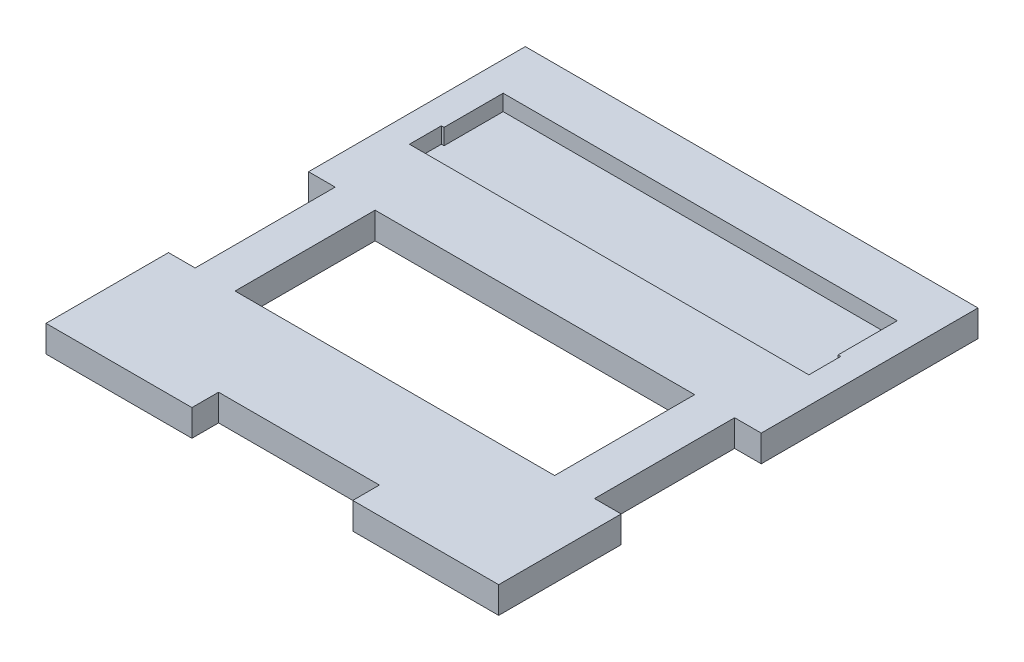
ISO-10303-21;
HEADER;
FILE_DESCRIPTION(('STEP AP214'),'2;1');
FILE_NAME('part.step','',(''),(''),'','','');
FILE_SCHEMA(('AUTOMOTIVE_DESIGN { 1 0 10303 214 1 1 1 1 }'));
ENDSEC;
DATA;
#1=APPLICATION_CONTEXT('core data for automotive mechanical design processes');
#2=APPLICATION_PROTOCOL_DEFINITION('international standard','automotive_design',2000,#1);
#3=PRODUCT_CONTEXT('',#1,'mechanical');
#4=PRODUCT('Part','Part','',(#3));
#5=PRODUCT_RELATED_PRODUCT_CATEGORY('part','',(#4));
#6=PRODUCT_DEFINITION_FORMATION('','',#4);
#7=PRODUCT_DEFINITION_CONTEXT('part definition',#1,'design');
#8=PRODUCT_DEFINITION('design','',#6,#7);
#9=PRODUCT_DEFINITION_SHAPE('','',#8);
#10=(LENGTH_UNIT() NAMED_UNIT(*) SI_UNIT(.MILLI.,.METRE.));
#11=(NAMED_UNIT(*) PLANE_ANGLE_UNIT() SI_UNIT($,.RADIAN.));
#12=(NAMED_UNIT(*) SI_UNIT($,.STERADIAN.) SOLID_ANGLE_UNIT());
#13=UNCERTAINTY_MEASURE_WITH_UNIT(LENGTH_MEASURE(1.E-05),#10,'distance_accuracy_value','');
#14=(GEOMETRIC_REPRESENTATION_CONTEXT(3) GLOBAL_UNCERTAINTY_ASSIGNED_CONTEXT((#13)) GLOBAL_UNIT_ASSIGNED_CONTEXT((#10,
#11,#12)) REPRESENTATION_CONTEXT('',''));
#15=CARTESIAN_POINT('',(0.,0.,0.));
#16=DIRECTION('',(0.,0.,1.));
#17=DIRECTION('',(1.,0.,0.));
#18=AXIS2_PLACEMENT_3D('',#15,#16,#17);
#19=CARTESIAN_POINT('',(-42.5,5.,45.));
#20=DIRECTION('',(0.,0.,-1.));
#21=DIRECTION('',(-1.,0.,0.));
#22=AXIS2_PLACEMENT_3D('',#19,#20,#21);
#23=PLANE('',#22);
#24=DIRECTION('',(0.,1.,0.));
#25=VECTOR('',#24,1.);
#26=CARTESIAN_POINT('',(15.1,0.,45.));
#27=LINE('',#26,#25);
#28=CARTESIAN_POINT('',(15.1,0.,45.));
#29=VERTEX_POINT('',#28);
#30=CARTESIAN_POINT('',(15.1,5.,45.));
#31=VERTEX_POINT('',#30);
#32=EDGE_CURVE('E307',#29,#31,#27,.T.);
#33=ORIENTED_EDGE('',*,*,#32,.F.);
#34=DIRECTION('',(1.,0.,0.));
#35=VECTOR('',#34,1.);
#36=CARTESIAN_POINT('',(-42.5,0.,45.));
#37=LINE('',#36,#35);
#38=CARTESIAN_POINT('',(42.5,0.,45.));
#39=VERTEX_POINT('',#38);
#40=EDGE_CURVE('E399',#29,#39,#37,.T.);
#41=ORIENTED_EDGE('',*,*,#40,.T.);
#42=DIRECTION('',(0.,-1.,0.));
#43=VECTOR('',#42,1.);
#44=CARTESIAN_POINT('',(42.5,5.,45.));
#45=LINE('',#44,#43);
#46=CARTESIAN_POINT('',(42.5,5.,45.));
#47=VERTEX_POINT('',#46);
#48=EDGE_CURVE('E387',#47,#39,#45,.T.);
#49=ORIENTED_EDGE('',*,*,#48,.F.);
#50=DIRECTION('',(1.,0.,0.));
#51=VECTOR('',#50,1.);
#52=CARTESIAN_POINT('',(-42.5,5.,45.));
#53=LINE('',#52,#51);
#54=EDGE_CURVE('E385',#31,#47,#53,.T.);
#55=ORIENTED_EDGE('',*,*,#54,.F.);
#56=EDGE_LOOP('',(#33,#41,#49,#55));
#57=FACE_BOUND('',#56,.T.);
#58=ADVANCED_FACE('F39',(#57),#23,.F.);
#59=CARTESIAN_POINT('',(0.,5.,0.));
#60=DIRECTION('',(0.,-1.,0.));
#61=DIRECTION('',(0.,0.,-1.));
#62=AXIS2_PLACEMENT_3D('',#59,#60,#61);
#63=PLANE('',#62);
#64=DIRECTION('',(-1.,0.,0.));
#65=VECTOR('',#64,1.);
#66=CARTESIAN_POINT('',(37.5,5.,-24.24));
#67=LINE('',#66,#65);
#68=CARTESIAN_POINT('',(37.5,5.,-24.24));
#69=VERTEX_POINT('',#68);
#70=CARTESIAN_POINT('',(37.,5.,-24.24));
#71=VERTEX_POINT('',#70);
#72=EDGE_CURVE('E265',#69,#71,#67,.T.);
#73=ORIENTED_EDGE('',*,*,#72,.F.);
#74=DIRECTION('',(0.,0.,-1.));
#75=VECTOR('',#74,1.);
#76=CARTESIAN_POINT('',(37.5,5.,-24.24));
#77=LINE('',#76,#75);
#78=CARTESIAN_POINT('',(37.5,5.,-18.24));
#79=VERTEX_POINT('',#78);
#80=EDGE_CURVE('E53',#79,#69,#77,.T.);
#81=ORIENTED_EDGE('',*,*,#80,.F.);
#82=DIRECTION('',(1.,0.,0.));
#83=VECTOR('',#82,1.);
#84=CARTESIAN_POINT('',(-37.5,5.,-18.24));
#85=LINE('',#84,#83);
#86=CARTESIAN_POINT('',(-37.5,5.,-18.24));
#87=VERTEX_POINT('',#86);
#88=EDGE_CURVE('E242',#87,#79,#85,.T.);
#89=ORIENTED_EDGE('',*,*,#88,.F.);
#90=DIRECTION('',(0.,0.,1.));
#91=VECTOR('',#90,1.);
#92=CARTESIAN_POINT('',(-37.5,5.,-24.24));
#93=LINE('',#92,#91);
#94=CARTESIAN_POINT('',(-37.5,5.,-24.24));
#95=VERTEX_POINT('',#94);
#96=EDGE_CURVE('E250',#95,#87,#93,.T.);
#97=ORIENTED_EDGE('',*,*,#96,.F.);
#98=DIRECTION('',(-1.,0.,0.));
#99=VECTOR('',#98,1.);
#100=CARTESIAN_POINT('',(-37.5,5.,-24.24));
#101=LINE('',#100,#99);
#102=CARTESIAN_POINT('',(-37.,5.,-24.24));
#103=VERTEX_POINT('',#102);
#104=EDGE_CURVE('E273',#103,#95,#101,.T.);
#105=ORIENTED_EDGE('',*,*,#104,.F.);
#106=DIRECTION('',(0.,0.,1.));
#107=VECTOR('',#106,1.);
#108=CARTESIAN_POINT('',(-37.,5.,-35.34));
#109=LINE('',#108,#107);
#110=CARTESIAN_POINT('',(-37.,5.,-35.34));
#111=VERTEX_POINT('',#110);
#112=EDGE_CURVE('E275',#111,#103,#109,.T.);
#113=ORIENTED_EDGE('',*,*,#112,.F.);
#114=DIRECTION('',(-1.,0.,0.));
#115=VECTOR('',#114,1.);
#116=CARTESIAN_POINT('',(-37.,5.,-35.34));
#117=LINE('',#116,#115);
#118=CARTESIAN_POINT('',(37.,5.,-35.34));
#119=VERTEX_POINT('',#118);
#120=EDGE_CURVE('E268',#119,#111,#117,.T.);
#121=ORIENTED_EDGE('',*,*,#120,.F.);
#122=DIRECTION('',(0.,0.,-1.));
#123=VECTOR('',#122,1.);
#124=CARTESIAN_POINT('',(37.,5.,-35.34));
#125=LINE('',#124,#123);
#126=EDGE_CURVE('E269',#71,#119,#125,.T.);
#127=ORIENTED_EDGE('',*,*,#126,.F.);
#128=EDGE_LOOP('',(#73,#81,#89,#97,#105,#113,#121,#127));
#129=FACE_BOUND('',#128,.T.);
#130=DIRECTION('',(-1.,0.,0.));
#131=VECTOR('',#130,1.);
#132=CARTESIAN_POINT('',(-30.,5.,-4.3));
#133=LINE('',#132,#131);
#134=CARTESIAN_POINT('',(30.,5.,-4.3));
#135=VERTEX_POINT('',#134);
#136=CARTESIAN_POINT('',(-30.,5.,-4.3));
#137=VERTEX_POINT('',#136);
#138=EDGE_CURVE('E355',#135,#137,#133,.T.);
#139=ORIENTED_EDGE('',*,*,#138,.F.);
#140=DIRECTION('',(0.,0.,-1.));
#141=VECTOR('',#140,1.);
#142=CARTESIAN_POINT('',(30.,5.,22.));
#143=LINE('',#142,#141);
#144=CARTESIAN_POINT('',(30.,5.,22.));
#145=VERTEX_POINT('',#144);
#146=EDGE_CURVE('E334',#145,#135,#143,.T.);
#147=ORIENTED_EDGE('',*,*,#146,.F.);
#148=DIRECTION('',(1.,0.,0.));
#149=VECTOR('',#148,1.);
#150=CARTESIAN_POINT('',(-30.,5.,22.));
#151=LINE('',#150,#149);
#152=CARTESIAN_POINT('',(-30.,5.,22.));
#153=VERTEX_POINT('',#152);
#154=EDGE_CURVE('E360',#153,#145,#151,.T.);
#155=ORIENTED_EDGE('',*,*,#154,.F.);
#156=DIRECTION('',(0.,0.,1.));
#157=VECTOR('',#156,1.);
#158=CARTESIAN_POINT('',(-30.,5.,22.));
#159=LINE('',#158,#157);
#160=EDGE_CURVE('E358',#137,#153,#159,.T.);
#161=ORIENTED_EDGE('',*,*,#160,.F.);
#162=EDGE_LOOP('',(#139,#147,#155,#161));
#163=FACE_BOUND('',#162,.T.);
#164=DIRECTION('',(0.,0.,-1.));
#165=VECTOR('',#164,1.);
#166=CARTESIAN_POINT('',(15.1,5.,40.));
#167=LINE('',#166,#165);
#168=CARTESIAN_POINT('',(15.1,5.,40.));
#169=VERTEX_POINT('',#168);
#170=EDGE_CURVE('E284',#31,#169,#167,.T.);
#171=ORIENTED_EDGE('',*,*,#170,.F.);
#172=ORIENTED_EDGE('',*,*,#54,.T.);
#173=DIRECTION('',(0.,0.,-1.));
#174=VECTOR('',#173,1.);
#175=CARTESIAN_POINT('',(42.5,5.,45.));
#176=LINE('',#175,#174);
#177=CARTESIAN_POINT('',(42.5,5.,22.));
#178=VERTEX_POINT('',#177);
#179=EDGE_CURVE('E375',#47,#178,#176,.T.);
#180=ORIENTED_EDGE('',*,*,#179,.T.);
#181=DIRECTION('',(1.,0.,0.));
#182=VECTOR('',#181,1.);
#183=CARTESIAN_POINT('',(37.5,5.,22.));
#184=LINE('',#183,#182);
#185=CARTESIAN_POINT('',(37.5,5.,22.));
#186=VERTEX_POINT('',#185);
#187=EDGE_CURVE('E339',#186,#178,#184,.T.);
#188=ORIENTED_EDGE('',*,*,#187,.F.);
#189=DIRECTION('',(0.,0.,1.));
#190=VECTOR('',#189,1.);
#191=CARTESIAN_POINT('',(37.5,5.,-4.30000000000001));
#192=LINE('',#191,#190);
#193=CARTESIAN_POINT('',(37.5,5.,-4.30000000000001));
#194=VERTEX_POINT('',#193);
#195=EDGE_CURVE('E349',#194,#186,#192,.T.);
#196=ORIENTED_EDGE('',*,*,#195,.F.);
#197=DIRECTION('',(-1.,0.,0.));
#198=VECTOR('',#197,1.);
#199=CARTESIAN_POINT('',(42.5,5.,-4.30000000000001));
#200=LINE('',#199,#198);
#201=CARTESIAN_POINT('',(42.5,5.,-4.30000000000001));
#202=VERTEX_POINT('',#201);
#203=EDGE_CURVE('E325',#202,#194,#200,.T.);
#204=ORIENTED_EDGE('',*,*,#203,.F.);
#205=CARTESIAN_POINT('',(42.5,5.,-45.));
#206=VERTEX_POINT('',#205);
#207=EDGE_CURVE('E376',#202,#206,#176,.T.);
#208=ORIENTED_EDGE('',*,*,#207,.T.);
#209=DIRECTION('',(-1.,0.,0.));
#210=VECTOR('',#209,1.);
#211=CARTESIAN_POINT('',(-42.5,5.,-45.));
#212=LINE('',#211,#210);
#213=CARTESIAN_POINT('',(-42.5,5.,-45.));
#214=VERTEX_POINT('',#213);
#215=EDGE_CURVE('E374',#206,#214,#212,.T.);
#216=ORIENTED_EDGE('',*,*,#215,.T.);
#217=DIRECTION('',(0.,0.,1.));
#218=VECTOR('',#217,1.);
#219=CARTESIAN_POINT('',(-42.5,5.,45.));
#220=LINE('',#219,#218);
#221=CARTESIAN_POINT('',(-42.5,5.,-4.30000000000001));
#222=VERTEX_POINT('',#221);
#223=EDGE_CURVE('E378',#214,#222,#220,.T.);
#224=ORIENTED_EDGE('',*,*,#223,.T.);
#225=DIRECTION('',(-1.,0.,0.));
#226=VECTOR('',#225,1.);
#227=CARTESIAN_POINT('',(-42.5,5.,-4.30000000000001));
#228=LINE('',#227,#226);
#229=CARTESIAN_POINT('',(-37.5,5.,-4.30000000000001));
#230=VERTEX_POINT('',#229);
#231=EDGE_CURVE('E323',#230,#222,#228,.T.);
#232=ORIENTED_EDGE('',*,*,#231,.F.);
#233=DIRECTION('',(0.,0.,-1.));
#234=VECTOR('',#233,1.);
#235=CARTESIAN_POINT('',(-37.5,5.,-4.30000000000001));
#236=LINE('',#235,#234);
#237=CARTESIAN_POINT('',(-37.5,5.,22.));
#238=VERTEX_POINT('',#237);
#239=EDGE_CURVE('E322',#238,#230,#236,.T.);
#240=ORIENTED_EDGE('',*,*,#239,.F.);
#241=DIRECTION('',(1.,0.,0.));
#242=VECTOR('',#241,1.);
#243=CARTESIAN_POINT('',(-37.5,5.,22.));
#244=LINE('',#243,#242);
#245=CARTESIAN_POINT('',(-42.5,5.,22.));
#246=VERTEX_POINT('',#245);
#247=EDGE_CURVE('E319',#246,#238,#244,.T.);
#248=ORIENTED_EDGE('',*,*,#247,.F.);
#249=CARTESIAN_POINT('',(-42.5,5.,45.));
#250=VERTEX_POINT('',#249);
#251=EDGE_CURVE('E377',#246,#250,#220,.T.);
#252=ORIENTED_EDGE('',*,*,#251,.T.);
#253=CARTESIAN_POINT('',(-15.1,5.,45.));
#254=VERTEX_POINT('',#253);
#255=EDGE_CURVE('E384',#250,#254,#53,.T.);
#256=ORIENTED_EDGE('',*,*,#255,.T.);
#257=DIRECTION('',(0.,0.,1.));
#258=VECTOR('',#257,1.);
#259=CARTESIAN_POINT('',(-15.1,5.,40.));
#260=LINE('',#259,#258);
#261=CARTESIAN_POINT('',(-15.1,5.,40.));
#262=VERTEX_POINT('',#261);
#263=EDGE_CURVE('E296',#262,#254,#260,.T.);
#264=ORIENTED_EDGE('',*,*,#263,.F.);
#265=DIRECTION('',(-1.,0.,0.));
#266=VECTOR('',#265,1.);
#267=CARTESIAN_POINT('',(-15.1,5.,40.));
#268=LINE('',#267,#266);
#269=EDGE_CURVE('E304',#169,#262,#268,.T.);
#270=ORIENTED_EDGE('',*,*,#269,.F.);
#271=EDGE_LOOP('',(#171,#172,#180,#188,#196,#204,#208,#216,#224,#232,#240,#248,#252,#256,#264,#270));
#272=FACE_BOUND('',#271,.T.);
#273=ADVANCED_FACE('F452',(#129,#163,#272),#63,.F.);
#274=CARTESIAN_POINT('',(0.,0.,0.));
#275=DIRECTION('',(0.,-1.,0.));
#276=DIRECTION('',(0.,0.,-1.));
#277=AXIS2_PLACEMENT_3D('',#274,#275,#276);
#278=PLANE('',#277);
#279=DIRECTION('',(0.,0.,1.));
#280=VECTOR('',#279,1.);
#281=CARTESIAN_POINT('',(30.,0.,0.));
#282=LINE('',#281,#280);
#283=CARTESIAN_POINT('',(30.,0.,-4.3));
#284=VERTEX_POINT('',#283);
#285=CARTESIAN_POINT('',(30.,0.,22.));
#286=VERTEX_POINT('',#285);
#287=EDGE_CURVE('E420',#284,#286,#282,.T.);
#288=ORIENTED_EDGE('',*,*,#287,.F.);
#289=DIRECTION('',(1.,0.,0.));
#290=VECTOR('',#289,1.);
#291=CARTESIAN_POINT('',(0.,0.,-4.3));
#292=LINE('',#291,#290);
#293=CARTESIAN_POINT('',(-30.,0.,-4.3));
#294=VERTEX_POINT('',#293);
#295=EDGE_CURVE('E413',#294,#284,#292,.T.);
#296=ORIENTED_EDGE('',*,*,#295,.F.);
#297=DIRECTION('',(0.,0.,-1.));
#298=VECTOR('',#297,1.);
#299=CARTESIAN_POINT('',(-30.,0.,0.));
#300=LINE('',#299,#298);
#301=CARTESIAN_POINT('',(-30.,0.,22.));
#302=VERTEX_POINT('',#301);
#303=EDGE_CURVE('E412',#302,#294,#300,.T.);
#304=ORIENTED_EDGE('',*,*,#303,.F.);
#305=DIRECTION('',(-1.,0.,0.));
#306=VECTOR('',#305,1.);
#307=CARTESIAN_POINT('',(0.,0.,22.));
#308=LINE('',#307,#306);
#309=EDGE_CURVE('E419',#286,#302,#308,.T.);
#310=ORIENTED_EDGE('',*,*,#309,.F.);
#311=EDGE_LOOP('',(#288,#296,#304,#310));
#312=FACE_BOUND('',#311,.T.);
#313=ORIENTED_EDGE('',*,*,#40,.F.);
#314=DIRECTION('',(0.,0.,-1.));
#315=VECTOR('',#314,1.);
#316=CARTESIAN_POINT('',(15.1,0.,40.));
#317=LINE('',#316,#315);
#318=CARTESIAN_POINT('',(15.1,0.,40.));
#319=VERTEX_POINT('',#318);
#320=EDGE_CURVE('E295',#29,#319,#317,.T.);
#321=ORIENTED_EDGE('',*,*,#320,.T.);
#322=DIRECTION('',(-1.,0.,0.));
#323=VECTOR('',#322,1.);
#324=CARTESIAN_POINT('',(-15.1,0.,40.));
#325=LINE('',#324,#323);
#326=CARTESIAN_POINT('',(-15.1,0.,40.));
#327=VERTEX_POINT('',#326);
#328=EDGE_CURVE('E300',#319,#327,#325,.T.);
#329=ORIENTED_EDGE('',*,*,#328,.T.);
#330=DIRECTION('',(0.,0.,1.));
#331=VECTOR('',#330,1.);
#332=CARTESIAN_POINT('',(-15.1,0.,40.));
#333=LINE('',#332,#331);
#334=CARTESIAN_POINT('',(-15.1,0.,45.));
#335=VERTEX_POINT('',#334);
#336=EDGE_CURVE('E65',#327,#335,#333,.T.);
#337=ORIENTED_EDGE('',*,*,#336,.T.);
#338=CARTESIAN_POINT('',(-42.5,0.,45.));
#339=VERTEX_POINT('',#338);
#340=EDGE_CURVE('E396',#339,#335,#37,.T.);
#341=ORIENTED_EDGE('',*,*,#340,.F.);
#342=DIRECTION('',(0.,0.,1.));
#343=VECTOR('',#342,1.);
#344=CARTESIAN_POINT('',(-42.5,0.,45.));
#345=LINE('',#344,#343);
#346=CARTESIAN_POINT('',(-42.5,0.,22.));
#347=VERTEX_POINT('',#346);
#348=EDGE_CURVE('E394',#347,#339,#345,.T.);
#349=ORIENTED_EDGE('',*,*,#348,.F.);
#350=DIRECTION('',(-1.,0.,0.));
#351=VECTOR('',#350,1.);
#352=CARTESIAN_POINT('',(0.,0.,22.));
#353=LINE('',#352,#351);
#354=CARTESIAN_POINT('',(-37.5,0.,22.));
#355=VERTEX_POINT('',#354);
#356=EDGE_CURVE('E430',#355,#347,#353,.T.);
#357=ORIENTED_EDGE('',*,*,#356,.F.);
#358=DIRECTION('',(0.,0.,1.));
#359=VECTOR('',#358,1.);
#360=CARTESIAN_POINT('',(-37.5,0.,0.));
#361=LINE('',#360,#359);
#362=CARTESIAN_POINT('',(-37.5,0.,-4.30000000000001));
#363=VERTEX_POINT('',#362);
#364=EDGE_CURVE('E50',#363,#355,#361,.T.);
#365=ORIENTED_EDGE('',*,*,#364,.F.);
#366=DIRECTION('',(1.,0.,0.));
#367=VECTOR('',#366,1.);
#368=CARTESIAN_POINT('',(0.,0.,-4.30000000000001));
#369=LINE('',#368,#367);
#370=CARTESIAN_POINT('',(-42.5,0.,-4.30000000000001));
#371=VERTEX_POINT('',#370);
#372=EDGE_CURVE('E11',#371,#363,#369,.T.);
#373=ORIENTED_EDGE('',*,*,#372,.F.);
#374=CARTESIAN_POINT('',(-42.5,0.,-45.));
#375=VERTEX_POINT('',#374);
#376=EDGE_CURVE('E392',#375,#371,#345,.T.);
#377=ORIENTED_EDGE('',*,*,#376,.F.);
#378=DIRECTION('',(-1.,0.,0.));
#379=VECTOR('',#378,1.);
#380=CARTESIAN_POINT('',(-42.5,0.,-45.));
#381=LINE('',#380,#379);
#382=CARTESIAN_POINT('',(42.5,0.,-45.));
#383=VERTEX_POINT('',#382);
#384=EDGE_CURVE('E388',#383,#375,#381,.T.);
#385=ORIENTED_EDGE('',*,*,#384,.F.);
#386=DIRECTION('',(0.,0.,-1.));
#387=VECTOR('',#386,1.);
#388=CARTESIAN_POINT('',(42.5,0.,45.));
#389=LINE('',#388,#387);
#390=CARTESIAN_POINT('',(42.5,0.,-4.30000000000001));
#391=VERTEX_POINT('',#390);
#392=EDGE_CURVE('E362',#391,#383,#389,.T.);
#393=ORIENTED_EDGE('',*,*,#392,.F.);
#394=DIRECTION('',(1.,0.,0.));
#395=VECTOR('',#394,1.);
#396=CARTESIAN_POINT('',(0.,0.,-4.30000000000001));
#397=LINE('',#396,#395);
#398=CARTESIAN_POINT('',(37.5,0.,-4.30000000000001));
#399=VERTEX_POINT('',#398);
#400=EDGE_CURVE('E424',#399,#391,#397,.T.);
#401=ORIENTED_EDGE('',*,*,#400,.F.);
#402=DIRECTION('',(0.,0.,-1.));
#403=VECTOR('',#402,1.);
#404=CARTESIAN_POINT('',(37.5,0.,0.));
#405=LINE('',#404,#403);
#406=CARTESIAN_POINT('',(37.5,0.,22.));
#407=VERTEX_POINT('',#406);
#408=EDGE_CURVE('E417',#407,#399,#405,.T.);
#409=ORIENTED_EDGE('',*,*,#408,.F.);
#410=DIRECTION('',(-1.,0.,0.));
#411=VECTOR('',#410,1.);
#412=CARTESIAN_POINT('',(0.,0.,22.));
#413=LINE('',#412,#411);
#414=CARTESIAN_POINT('',(42.5,0.,22.));
#415=VERTEX_POINT('',#414);
#416=EDGE_CURVE('E422',#415,#407,#413,.T.);
#417=ORIENTED_EDGE('',*,*,#416,.F.);
#418=EDGE_CURVE('E390',#39,#415,#389,.T.);
#419=ORIENTED_EDGE('',*,*,#418,.F.);
#420=EDGE_LOOP('',(#313,#321,#329,#337,#341,#349,#357,#365,#373,#377,#385,#393,#401,#409,#417,#419));
#421=FACE_BOUND('',#420,.T.);
#422=ADVANCED_FACE('F438',(#312,#421),#278,.T.);
#423=CARTESIAN_POINT('',(42.5,5.,45.));
#424=DIRECTION('',(-1.,0.,0.));
#425=DIRECTION('',(0.,0.,1.));
#426=AXIS2_PLACEMENT_3D('',#423,#424,#425);
#427=PLANE('',#426);
#428=DIRECTION('',(0.,1.,0.));
#429=VECTOR('',#428,1.);
#430=CARTESIAN_POINT('',(42.5,-2.5,-4.30000000000001));
#431=LINE('',#430,#429);
#432=EDGE_CURVE('E311',#391,#202,#431,.T.);
#433=ORIENTED_EDGE('',*,*,#432,.F.);
#434=ORIENTED_EDGE('',*,*,#392,.T.);
#435=DIRECTION('',(0.,-1.,0.));
#436=VECTOR('',#435,1.);
#437=CARTESIAN_POINT('',(42.5,5.,-45.));
#438=LINE('',#437,#436);
#439=EDGE_CURVE('E409',#206,#383,#438,.T.);
#440=ORIENTED_EDGE('',*,*,#439,.F.);
#441=ORIENTED_EDGE('',*,*,#207,.F.);
#442=EDGE_LOOP('',(#433,#434,#440,#441));
#443=FACE_BOUND('',#442,.T.);
#444=ADVANCED_FACE('F475',(#443),#427,.F.);
#445=CARTESIAN_POINT('',(-42.5,5.,45.));
#446=DIRECTION('',(1.,0.,0.));
#447=DIRECTION('',(0.,0.,-1.));
#448=AXIS2_PLACEMENT_3D('',#445,#446,#447);
#449=PLANE('',#448);
#450=DIRECTION('',(0.,1.,0.));
#451=VECTOR('',#450,1.);
#452=CARTESIAN_POINT('',(-42.5,-2.5,22.));
#453=LINE('',#452,#451);
#454=EDGE_CURVE('E329',#347,#246,#453,.T.);
#455=ORIENTED_EDGE('',*,*,#454,.F.);
#456=ORIENTED_EDGE('',*,*,#348,.T.);
#457=DIRECTION('',(0.,-1.,0.));
#458=VECTOR('',#457,1.);
#459=CARTESIAN_POINT('',(-42.5,5.,45.));
#460=LINE('',#459,#458);
#461=EDGE_CURVE('E405',#250,#339,#460,.T.);
#462=ORIENTED_EDGE('',*,*,#461,.F.);
#463=ORIENTED_EDGE('',*,*,#251,.F.);
#464=EDGE_LOOP('',(#455,#456,#462,#463));
#465=FACE_BOUND('',#464,.T.);
#466=ADVANCED_FACE('F447',(#465),#449,.F.);
#467=ORIENTED_EDGE('',*,*,#418,.T.);
#468=DIRECTION('',(0.,1.,0.));
#469=VECTOR('',#468,1.);
#470=CARTESIAN_POINT('',(42.5,-2.5,22.));
#471=LINE('',#470,#469);
#472=EDGE_CURVE('E345',#415,#178,#471,.T.);
#473=ORIENTED_EDGE('',*,*,#472,.T.);
#474=ORIENTED_EDGE('',*,*,#179,.F.);
#475=ORIENTED_EDGE('',*,*,#48,.T.);
#476=EDGE_LOOP('',(#467,#473,#474,#475));
#477=FACE_BOUND('',#476,.T.);
#478=ADVANCED_FACE('F41',(#477),#427,.F.);
#479=CARTESIAN_POINT('',(-42.5,5.,-45.));
#480=DIRECTION('',(0.,0.,1.));
#481=DIRECTION('',(1.,0.,0.));
#482=AXIS2_PLACEMENT_3D('',#479,#480,#481);
#483=PLANE('',#482);
#484=ORIENTED_EDGE('',*,*,#384,.T.);
#485=DIRECTION('',(0.,-1.,0.));
#486=VECTOR('',#485,1.);
#487=CARTESIAN_POINT('',(-42.5,5.,-45.));
#488=LINE('',#487,#486);
#489=EDGE_CURVE('E403',#214,#375,#488,.T.);
#490=ORIENTED_EDGE('',*,*,#489,.F.);
#491=ORIENTED_EDGE('',*,*,#215,.F.);
#492=ORIENTED_EDGE('',*,*,#439,.T.);
#493=EDGE_LOOP('',(#484,#490,#491,#492));
#494=FACE_BOUND('',#493,.T.);
#495=ADVANCED_FACE('F466',(#494),#483,.F.);
#496=ORIENTED_EDGE('',*,*,#376,.T.);
#497=DIRECTION('',(0.,1.,0.));
#498=VECTOR('',#497,1.);
#499=CARTESIAN_POINT('',(-42.5,-2.5,-4.30000000000001));
#500=LINE('',#499,#498);
#501=EDGE_CURVE('E327',#371,#222,#500,.T.);
#502=ORIENTED_EDGE('',*,*,#501,.T.);
#503=ORIENTED_EDGE('',*,*,#223,.F.);
#504=ORIENTED_EDGE('',*,*,#489,.T.);
#505=EDGE_LOOP('',(#496,#502,#503,#504));
#506=FACE_BOUND('',#505,.T.);
#507=ADVANCED_FACE('F460',(#506),#449,.F.);
#508=ORIENTED_EDGE('',*,*,#340,.T.);
#509=DIRECTION('',(0.,1.,0.));
#510=VECTOR('',#509,1.);
#511=CARTESIAN_POINT('',(-15.1,0.,45.));
#512=LINE('',#511,#510);
#513=EDGE_CURVE('E315',#335,#254,#512,.T.);
#514=ORIENTED_EDGE('',*,*,#513,.T.);
#515=ORIENTED_EDGE('',*,*,#255,.F.);
#516=ORIENTED_EDGE('',*,*,#461,.T.);
#517=EDGE_LOOP('',(#508,#514,#515,#516));
#518=FACE_BOUND('',#517,.T.);
#519=ADVANCED_FACE('F497',(#518),#23,.F.);
#520=CARTESIAN_POINT('',(30.,-2.5,22.));
#521=DIRECTION('',(1.,0.,0.));
#522=DIRECTION('',(0.,0.,-1.));
#523=AXIS2_PLACEMENT_3D('',#520,#521,#522);
#524=PLANE('',#523);
#525=ORIENTED_EDGE('',*,*,#287,.T.);
#526=DIRECTION('',(0.,1.,0.));
#527=VECTOR('',#526,1.);
#528=CARTESIAN_POINT('',(30.,-2.5,22.));
#529=LINE('',#528,#527);
#530=EDGE_CURVE('E361',#286,#145,#529,.T.);
#531=ORIENTED_EDGE('',*,*,#530,.T.);
#532=ORIENTED_EDGE('',*,*,#146,.T.);
#533=DIRECTION('',(0.,1.,0.));
#534=VECTOR('',#533,1.);
#535=CARTESIAN_POINT('',(30.,-2.5,-4.3));
#536=LINE('',#535,#534);
#537=EDGE_CURVE('E365',#284,#135,#536,.T.);
#538=ORIENTED_EDGE('',*,*,#537,.F.);
#539=EDGE_LOOP('',(#525,#531,#532,#538));
#540=FACE_BOUND('',#539,.T.);
#541=ADVANCED_FACE('F501',(#540),#524,.F.);
#542=CARTESIAN_POINT('',(-30.,-2.5,22.));
#543=DIRECTION('',(0.,0.,1.));
#544=DIRECTION('',(1.,0.,0.));
#545=AXIS2_PLACEMENT_3D('',#542,#543,#544);
#546=PLANE('',#545);
#547=ORIENTED_EDGE('',*,*,#309,.T.);
#548=DIRECTION('',(0.,1.,0.));
#549=VECTOR('',#548,1.);
#550=CARTESIAN_POINT('',(-30.,-2.5,22.));
#551=LINE('',#550,#549);
#552=EDGE_CURVE('E366',#302,#153,#551,.T.);
#553=ORIENTED_EDGE('',*,*,#552,.T.);
#554=ORIENTED_EDGE('',*,*,#154,.T.);
#555=ORIENTED_EDGE('',*,*,#530,.F.);
#556=EDGE_LOOP('',(#547,#553,#554,#555));
#557=FACE_BOUND('',#556,.T.);
#558=ADVANCED_FACE('F507',(#557),#546,.F.);
#559=CARTESIAN_POINT('',(-30.,-2.5,22.));
#560=DIRECTION('',(-1.,0.,0.));
#561=DIRECTION('',(0.,0.,1.));
#562=AXIS2_PLACEMENT_3D('',#559,#560,#561);
#563=PLANE('',#562);
#564=ORIENTED_EDGE('',*,*,#303,.T.);
#565=DIRECTION('',(0.,1.,0.));
#566=VECTOR('',#565,1.);
#567=CARTESIAN_POINT('',(-30.,-2.5,-4.3));
#568=LINE('',#567,#566);
#569=EDGE_CURVE('E368',#294,#137,#568,.T.);
#570=ORIENTED_EDGE('',*,*,#569,.T.);
#571=ORIENTED_EDGE('',*,*,#160,.T.);
#572=ORIENTED_EDGE('',*,*,#552,.F.);
#573=EDGE_LOOP('',(#564,#570,#571,#572));
#574=FACE_BOUND('',#573,.T.);
#575=ADVANCED_FACE('F532',(#574),#563,.F.);
#576=CARTESIAN_POINT('',(-30.,-2.5,-4.3));
#577=DIRECTION('',(0.,0.,-1.));
#578=DIRECTION('',(-1.,0.,0.));
#579=AXIS2_PLACEMENT_3D('',#576,#577,#578);
#580=PLANE('',#579);
#581=ORIENTED_EDGE('',*,*,#295,.T.);
#582=ORIENTED_EDGE('',*,*,#537,.T.);
#583=ORIENTED_EDGE('',*,*,#138,.T.);
#584=ORIENTED_EDGE('',*,*,#569,.F.);
#585=EDGE_LOOP('',(#581,#582,#583,#584));
#586=FACE_BOUND('',#585,.T.);
#587=ADVANCED_FACE('F530',(#586),#580,.F.);
#588=CARTESIAN_POINT('',(42.5,-2.5,-4.30000000000001));
#589=DIRECTION('',(0.,0.,-1.));
#590=DIRECTION('',(-1.,0.,0.));
#591=AXIS2_PLACEMENT_3D('',#588,#589,#590);
#592=PLANE('',#591);
#593=ORIENTED_EDGE('',*,*,#400,.T.);
#594=ORIENTED_EDGE('',*,*,#432,.T.);
#595=ORIENTED_EDGE('',*,*,#203,.T.);
#596=DIRECTION('',(0.,1.,0.));
#597=VECTOR('',#596,1.);
#598=CARTESIAN_POINT('',(37.5,-2.5,-4.30000000000001));
#599=LINE('',#598,#597);
#600=EDGE_CURVE('E340',#399,#194,#599,.T.);
#601=ORIENTED_EDGE('',*,*,#600,.F.);
#602=EDGE_LOOP('',(#593,#594,#595,#601));
#603=FACE_BOUND('',#602,.T.);
#604=ADVANCED_FACE('F473',(#603),#592,.F.);
#605=CARTESIAN_POINT('',(37.5,-2.5,22.));
#606=DIRECTION('',(0.,0.,1.));
#607=DIRECTION('',(1.,0.,0.));
#608=AXIS2_PLACEMENT_3D('',#605,#606,#607);
#609=PLANE('',#608);
#610=ORIENTED_EDGE('',*,*,#416,.T.);
#611=DIRECTION('',(0.,1.,0.));
#612=VECTOR('',#611,1.);
#613=CARTESIAN_POINT('',(37.5,-2.5,22.));
#614=LINE('',#613,#612);
#615=EDGE_CURVE('E338',#407,#186,#614,.T.);
#616=ORIENTED_EDGE('',*,*,#615,.T.);
#617=ORIENTED_EDGE('',*,*,#187,.T.);
#618=ORIENTED_EDGE('',*,*,#472,.F.);
#619=EDGE_LOOP('',(#610,#616,#617,#618));
#620=FACE_BOUND('',#619,.T.);
#621=ADVANCED_FACE('F536',(#620),#609,.F.);
#622=CARTESIAN_POINT('',(37.5,-2.5,-4.30000000000001));
#623=DIRECTION('',(-1.,0.,0.));
#624=DIRECTION('',(0.,0.,1.));
#625=AXIS2_PLACEMENT_3D('',#622,#623,#624);
#626=PLANE('',#625);
#627=ORIENTED_EDGE('',*,*,#408,.T.);
#628=ORIENTED_EDGE('',*,*,#600,.T.);
#629=ORIENTED_EDGE('',*,*,#195,.T.);
#630=ORIENTED_EDGE('',*,*,#615,.F.);
#631=EDGE_LOOP('',(#627,#628,#629,#630));
#632=FACE_BOUND('',#631,.T.);
#633=ADVANCED_FACE('F476',(#632),#626,.F.);
#634=CARTESIAN_POINT('',(-42.5,-2.5,-4.30000000000001));
#635=DIRECTION('',(0.,0.,-1.));
#636=DIRECTION('',(-1.,0.,0.));
#637=AXIS2_PLACEMENT_3D('',#634,#635,#636);
#638=PLANE('',#637);
#639=ORIENTED_EDGE('',*,*,#372,.T.);
#640=DIRECTION('',(0.,1.,0.));
#641=VECTOR('',#640,1.);
#642=CARTESIAN_POINT('',(-37.5,-2.5,-4.30000000000001));
#643=LINE('',#642,#641);
#644=EDGE_CURVE('E331',#363,#230,#643,.T.);
#645=ORIENTED_EDGE('',*,*,#644,.T.);
#646=ORIENTED_EDGE('',*,*,#231,.T.);
#647=ORIENTED_EDGE('',*,*,#501,.F.);
#648=EDGE_LOOP('',(#639,#645,#646,#647));
#649=FACE_BOUND('',#648,.T.);
#650=ADVANCED_FACE('F459',(#649),#638,.F.);
#651=CARTESIAN_POINT('',(-37.5,-2.5,-4.30000000000001));
#652=DIRECTION('',(1.,0.,0.));
#653=DIRECTION('',(0.,0.,-1.));
#654=AXIS2_PLACEMENT_3D('',#651,#652,#653);
#655=PLANE('',#654);
#656=ORIENTED_EDGE('',*,*,#364,.T.);
#657=DIRECTION('',(0.,1.,0.));
#658=VECTOR('',#657,1.);
#659=CARTESIAN_POINT('',(-37.5,-2.5,22.));
#660=LINE('',#659,#658);
#661=EDGE_CURVE('E333',#355,#238,#660,.T.);
#662=ORIENTED_EDGE('',*,*,#661,.T.);
#663=ORIENTED_EDGE('',*,*,#239,.T.);
#664=ORIENTED_EDGE('',*,*,#644,.F.);
#665=EDGE_LOOP('',(#656,#662,#663,#664));
#666=FACE_BOUND('',#665,.T.);
#667=ADVANCED_FACE('F433',(#666),#655,.F.);
#668=CARTESIAN_POINT('',(-37.5,-2.5,22.));
#669=DIRECTION('',(0.,0.,1.));
#670=DIRECTION('',(1.,0.,0.));
#671=AXIS2_PLACEMENT_3D('',#668,#669,#670);
#672=PLANE('',#671);
#673=ORIENTED_EDGE('',*,*,#356,.T.);
#674=ORIENTED_EDGE('',*,*,#454,.T.);
#675=ORIENTED_EDGE('',*,*,#247,.T.);
#676=ORIENTED_EDGE('',*,*,#661,.F.);
#677=EDGE_LOOP('',(#673,#674,#675,#676));
#678=FACE_BOUND('',#677,.T.);
#679=ADVANCED_FACE('F445',(#678),#672,.F.);
#680=CARTESIAN_POINT('',(15.1,0.,40.));
#681=DIRECTION('',(1.,0.,0.));
#682=DIRECTION('',(0.,0.,-1.));
#683=AXIS2_PLACEMENT_3D('',#680,#681,#682);
#684=PLANE('',#683);
#685=ORIENTED_EDGE('',*,*,#170,.T.);
#686=DIRECTION('',(0.,1.,0.));
#687=VECTOR('',#686,1.);
#688=CARTESIAN_POINT('',(15.1,0.,40.));
#689=LINE('',#688,#687);
#690=EDGE_CURVE('E305',#319,#169,#689,.T.);
#691=ORIENTED_EDGE('',*,*,#690,.F.);
#692=ORIENTED_EDGE('',*,*,#320,.F.);
#693=ORIENTED_EDGE('',*,*,#32,.T.);
#694=EDGE_LOOP('',(#685,#691,#692,#693));
#695=FACE_BOUND('',#694,.T.);
#696=ADVANCED_FACE('F491',(#695),#684,.F.);
#697=CARTESIAN_POINT('',(-15.1,0.,40.));
#698=DIRECTION('',(-1.,0.,0.));
#699=DIRECTION('',(0.,0.,1.));
#700=AXIS2_PLACEMENT_3D('',#697,#698,#699);
#701=PLANE('',#700);
#702=ORIENTED_EDGE('',*,*,#263,.T.);
#703=ORIENTED_EDGE('',*,*,#513,.F.);
#704=ORIENTED_EDGE('',*,*,#336,.F.);
#705=DIRECTION('',(0.,1.,0.));
#706=VECTOR('',#705,1.);
#707=CARTESIAN_POINT('',(-15.1,0.,40.));
#708=LINE('',#707,#706);
#709=EDGE_CURVE('E314',#327,#262,#708,.T.);
#710=ORIENTED_EDGE('',*,*,#709,.T.);
#711=EDGE_LOOP('',(#702,#703,#704,#710));
#712=FACE_BOUND('',#711,.T.);
#713=ADVANCED_FACE('F500',(#712),#701,.F.);
#714=CARTESIAN_POINT('',(-15.1,0.,40.));
#715=DIRECTION('',(0.,0.,-1.));
#716=DIRECTION('',(-1.,0.,0.));
#717=AXIS2_PLACEMENT_3D('',#714,#715,#716);
#718=PLANE('',#717);
#719=ORIENTED_EDGE('',*,*,#269,.T.);
#720=ORIENTED_EDGE('',*,*,#709,.F.);
#721=ORIENTED_EDGE('',*,*,#328,.F.);
#722=ORIENTED_EDGE('',*,*,#690,.T.);
#723=EDGE_LOOP('',(#719,#720,#721,#722));
#724=FACE_BOUND('',#723,.T.);
#725=ADVANCED_FACE('F496',(#724),#718,.F.);
#726=CARTESIAN_POINT('',(37.5,2.,-24.24));
#727=DIRECTION('',(1.,0.,0.));
#728=DIRECTION('',(0.,0.,-1.));
#729=AXIS2_PLACEMENT_3D('',#726,#727,#728);
#730=PLANE('',#729);
#731=ORIENTED_EDGE('',*,*,#80,.T.);
#732=DIRECTION('',(0.,1.,0.));
#733=VECTOR('',#732,1.);
#734=CARTESIAN_POINT('',(37.5,2.,-24.24));
#735=LINE('',#734,#733);
#736=CARTESIAN_POINT('',(37.5,2.,-24.24));
#737=VERTEX_POINT('',#736);
#738=EDGE_CURVE('E224',#737,#69,#735,.T.);
#739=ORIENTED_EDGE('',*,*,#738,.F.);
#740=DIRECTION('',(0.,0.,-1.));
#741=VECTOR('',#740,1.);
#742=CARTESIAN_POINT('',(37.5,2.,-24.24));
#743=LINE('',#742,#741);
#744=CARTESIAN_POINT('',(37.5,2.,-18.24));
#745=VERTEX_POINT('',#744);
#746=EDGE_CURVE('E222',#745,#737,#743,.T.);
#747=ORIENTED_EDGE('',*,*,#746,.F.);
#748=DIRECTION('',(0.,1.,0.));
#749=VECTOR('',#748,1.);
#750=CARTESIAN_POINT('',(37.5,2.,-18.24));
#751=LINE('',#750,#749);
#752=EDGE_CURVE('E278',#745,#79,#751,.T.);
#753=ORIENTED_EDGE('',*,*,#752,.T.);
#754=EDGE_LOOP('',(#731,#739,#747,#753));
#755=FACE_BOUND('',#754,.T.);
#756=ADVANCED_FACE('F225',(#755),#730,.F.);
#757=CARTESIAN_POINT('',(-37.5,2.,-18.24));
#758=DIRECTION('',(0.,0.,1.));
#759=DIRECTION('',(1.,0.,0.));
#760=AXIS2_PLACEMENT_3D('',#757,#758,#759);
#761=PLANE('',#760);
#762=ORIENTED_EDGE('',*,*,#88,.T.);
#763=ORIENTED_EDGE('',*,*,#752,.F.);
#764=DIRECTION('',(1.,0.,0.));
#765=VECTOR('',#764,1.);
#766=CARTESIAN_POINT('',(-37.5,2.,-18.24));
#767=LINE('',#766,#765);
#768=CARTESIAN_POINT('',(-37.5,2.,-18.24));
#769=VERTEX_POINT('',#768);
#770=EDGE_CURVE('E233',#769,#745,#767,.T.);
#771=ORIENTED_EDGE('',*,*,#770,.F.);
#772=DIRECTION('',(0.,1.,0.));
#773=VECTOR('',#772,1.);
#774=CARTESIAN_POINT('',(-37.5,2.,-18.24));
#775=LINE('',#774,#773);
#776=EDGE_CURVE('E282',#769,#87,#775,.T.);
#777=ORIENTED_EDGE('',*,*,#776,.T.);
#778=EDGE_LOOP('',(#762,#763,#771,#777));
#779=FACE_BOUND('',#778,.T.);
#780=ADVANCED_FACE('F558',(#779),#761,.F.);
#781=CARTESIAN_POINT('',(-37.5,2.,-24.24));
#782=DIRECTION('',(-1.,0.,0.));
#783=DIRECTION('',(0.,0.,1.));
#784=AXIS2_PLACEMENT_3D('',#781,#782,#783);
#785=PLANE('',#784);
#786=ORIENTED_EDGE('',*,*,#96,.T.);
#787=ORIENTED_EDGE('',*,*,#776,.F.);
#788=DIRECTION('',(0.,0.,1.));
#789=VECTOR('',#788,1.);
#790=CARTESIAN_POINT('',(-37.5,2.,-24.24));
#791=LINE('',#790,#789);
#792=CARTESIAN_POINT('',(-37.5,2.,-24.24));
#793=VERTEX_POINT('',#792);
#794=EDGE_CURVE('E258',#793,#769,#791,.T.);
#795=ORIENTED_EDGE('',*,*,#794,.F.);
#796=DIRECTION('',(0.,1.,0.));
#797=VECTOR('',#796,1.);
#798=CARTESIAN_POINT('',(-37.5,2.,-24.24));
#799=LINE('',#798,#797);
#800=EDGE_CURVE('E281',#793,#95,#799,.T.);
#801=ORIENTED_EDGE('',*,*,#800,.T.);
#802=EDGE_LOOP('',(#786,#787,#795,#801));
#803=FACE_BOUND('',#802,.T.);
#804=ADVANCED_FACE('F573',(#803),#785,.F.);
#805=CARTESIAN_POINT('',(-37.5,2.,-24.24));
#806=DIRECTION('',(0.,0.,-1.));
#807=DIRECTION('',(-1.,0.,0.));
#808=AXIS2_PLACEMENT_3D('',#805,#806,#807);
#809=PLANE('',#808);
#810=ORIENTED_EDGE('',*,*,#104,.T.);
#811=ORIENTED_EDGE('',*,*,#800,.F.);
#812=DIRECTION('',(-1.,0.,0.));
#813=VECTOR('',#812,1.);
#814=CARTESIAN_POINT('',(-37.5,2.,-24.24));
#815=LINE('',#814,#813);
#816=CARTESIAN_POINT('',(-37.,2.,-24.24));
#817=VERTEX_POINT('',#816);
#818=EDGE_CURVE('E260',#817,#793,#815,.T.);
#819=ORIENTED_EDGE('',*,*,#818,.F.);
#820=DIRECTION('',(0.,1.,0.));
#821=VECTOR('',#820,1.);
#822=CARTESIAN_POINT('',(-37.,2.,-24.24));
#823=LINE('',#822,#821);
#824=EDGE_CURVE('E286',#817,#103,#823,.T.);
#825=ORIENTED_EDGE('',*,*,#824,.T.);
#826=EDGE_LOOP('',(#810,#811,#819,#825));
#827=FACE_BOUND('',#826,.T.);
#828=ADVANCED_FACE('F569',(#827),#809,.F.);
#829=CARTESIAN_POINT('',(-37.,2.,-35.34));
#830=DIRECTION('',(-1.,0.,0.));
#831=DIRECTION('',(0.,0.,1.));
#832=AXIS2_PLACEMENT_3D('',#829,#830,#831);
#833=PLANE('',#832);
#834=ORIENTED_EDGE('',*,*,#112,.T.);
#835=ORIENTED_EDGE('',*,*,#824,.F.);
#836=DIRECTION('',(0.,0.,1.));
#837=VECTOR('',#836,1.);
#838=CARTESIAN_POINT('',(-37.,2.,-35.34));
#839=LINE('',#838,#837);
#840=CARTESIAN_POINT('',(-37.,2.,-35.34));
#841=VERTEX_POINT('',#840);
#842=EDGE_CURVE('E251',#841,#817,#839,.T.);
#843=ORIENTED_EDGE('',*,*,#842,.F.);
#844=DIRECTION('',(0.,1.,0.));
#845=VECTOR('',#844,1.);
#846=CARTESIAN_POINT('',(-37.,2.,-35.34));
#847=LINE('',#846,#845);
#848=EDGE_CURVE('E288',#841,#111,#847,.T.);
#849=ORIENTED_EDGE('',*,*,#848,.T.);
#850=EDGE_LOOP('',(#834,#835,#843,#849));
#851=FACE_BOUND('',#850,.T.);
#852=ADVANCED_FACE('F566',(#851),#833,.F.);
#853=CARTESIAN_POINT('',(-37.,2.,-35.34));
#854=DIRECTION('',(0.,0.,-1.));
#855=DIRECTION('',(-1.,0.,0.));
#856=AXIS2_PLACEMENT_3D('',#853,#854,#855);
#857=PLANE('',#856);
#858=ORIENTED_EDGE('',*,*,#120,.T.);
#859=ORIENTED_EDGE('',*,*,#848,.F.);
#860=DIRECTION('',(-1.,0.,0.));
#861=VECTOR('',#860,1.);
#862=CARTESIAN_POINT('',(-37.,2.,-35.34));
#863=LINE('',#862,#861);
#864=CARTESIAN_POINT('',(37.,2.,-35.34));
#865=VERTEX_POINT('',#864);
#866=EDGE_CURVE('E252',#865,#841,#863,.T.);
#867=ORIENTED_EDGE('',*,*,#866,.F.);
#868=DIRECTION('',(0.,1.,0.));
#869=VECTOR('',#868,1.);
#870=CARTESIAN_POINT('',(37.,2.,-35.34));
#871=LINE('',#870,#869);
#872=EDGE_CURVE('E293',#865,#119,#871,.T.);
#873=ORIENTED_EDGE('',*,*,#872,.T.);
#874=EDGE_LOOP('',(#858,#859,#867,#873));
#875=FACE_BOUND('',#874,.T.);
#876=ADVANCED_FACE('F565',(#875),#857,.F.);
#877=CARTESIAN_POINT('',(37.,2.,-35.34));
#878=DIRECTION('',(1.,0.,0.));
#879=DIRECTION('',(0.,0.,-1.));
#880=AXIS2_PLACEMENT_3D('',#877,#878,#879);
#881=PLANE('',#880);
#882=ORIENTED_EDGE('',*,*,#126,.T.);
#883=ORIENTED_EDGE('',*,*,#872,.F.);
#884=DIRECTION('',(0.,0.,-1.));
#885=VECTOR('',#884,1.);
#886=CARTESIAN_POINT('',(37.,2.,-35.34));
#887=LINE('',#886,#885);
#888=CARTESIAN_POINT('',(37.,2.,-24.24));
#889=VERTEX_POINT('',#888);
#890=EDGE_CURVE('E237',#889,#865,#887,.T.);
#891=ORIENTED_EDGE('',*,*,#890,.F.);
#892=DIRECTION('',(0.,1.,0.));
#893=VECTOR('',#892,1.);
#894=CARTESIAN_POINT('',(37.,2.,-24.24));
#895=LINE('',#894,#893);
#896=EDGE_CURVE('E229',#889,#71,#895,.T.);
#897=ORIENTED_EDGE('',*,*,#896,.T.);
#898=EDGE_LOOP('',(#882,#883,#891,#897));
#899=FACE_BOUND('',#898,.T.);
#900=ADVANCED_FACE('F559',(#899),#881,.F.);
#901=CARTESIAN_POINT('',(37.5,2.,-24.24));
#902=DIRECTION('',(0.,0.,-1.));
#903=DIRECTION('',(-1.,0.,0.));
#904=AXIS2_PLACEMENT_3D('',#901,#902,#903);
#905=PLANE('',#904);
#906=ORIENTED_EDGE('',*,*,#72,.T.);
#907=ORIENTED_EDGE('',*,*,#896,.F.);
#908=DIRECTION('',(-1.,0.,0.));
#909=VECTOR('',#908,1.);
#910=CARTESIAN_POINT('',(37.5,2.,-24.24));
#911=LINE('',#910,#909);
#912=EDGE_CURVE('E234',#737,#889,#911,.T.);
#913=ORIENTED_EDGE('',*,*,#912,.F.);
#914=ORIENTED_EDGE('',*,*,#738,.T.);
#915=EDGE_LOOP('',(#906,#907,#913,#914));
#916=FACE_BOUND('',#915,.T.);
#917=ADVANCED_FACE('F232',(#916),#905,.F.);
#918=CARTESIAN_POINT('',(0.,2.,0.));
#919=DIRECTION('',(0.,1.,0.));
#920=DIRECTION('',(0.,0.,1.));
#921=AXIS2_PLACEMENT_3D('',#918,#919,#920);
#922=PLANE('',#921);
#923=ORIENTED_EDGE('',*,*,#746,.T.);
#924=ORIENTED_EDGE('',*,*,#912,.T.);
#925=ORIENTED_EDGE('',*,*,#890,.T.);
#926=ORIENTED_EDGE('',*,*,#866,.T.);
#927=ORIENTED_EDGE('',*,*,#842,.T.);
#928=ORIENTED_EDGE('',*,*,#818,.T.);
#929=ORIENTED_EDGE('',*,*,#794,.T.);
#930=ORIENTED_EDGE('',*,*,#770,.T.);
#931=EDGE_LOOP('',(#923,#924,#925,#926,#927,#928,#929,#930));
#932=FACE_BOUND('',#931,.T.);
#933=ADVANCED_FACE('F241',(#932),#922,.T.);
#934=CLOSED_SHELL('',(#58,#273,#422,#444,#466,#478,#495,#507,#519,#541,#558,#575,#587,#604,#621,
#633,#650,#667,#679,#696,#713,#725,#756,#780,#804,#828,#852,#876,#900,#917,#933));
#935=MANIFOLD_SOLID_BREP('B2',#934);
#936=ADVANCED_BREP_SHAPE_REPRESENTATION('',(#18,#935),#14);
#937=SHAPE_DEFINITION_REPRESENTATION(#9,#936);
ENDSEC;
END-ISO-10303-21;
